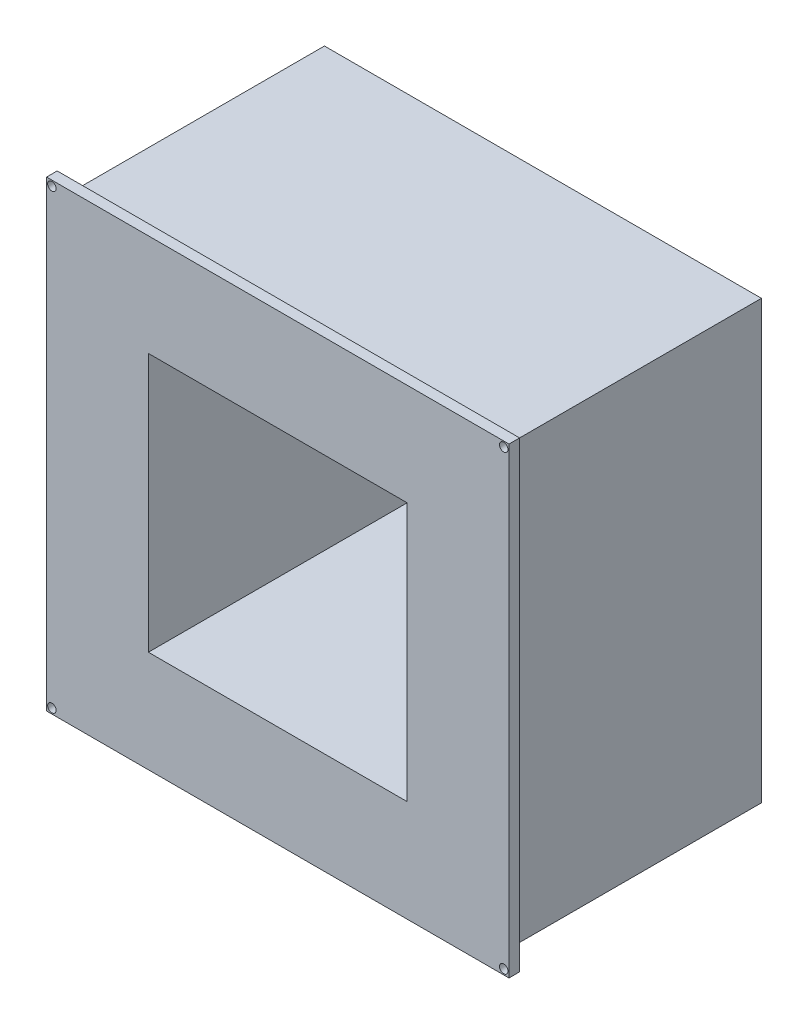
ISO-10303-21;
HEADER;
FILE_DESCRIPTION(('STEP AP214'),'2;1');
FILE_NAME('part.step','',(''),(''),'','','');
FILE_SCHEMA(('AUTOMOTIVE_DESIGN { 1 0 10303 214 1 1 1 1 }'));
ENDSEC;
DATA;
#1=APPLICATION_CONTEXT('core data for automotive mechanical design processes');
#2=APPLICATION_PROTOCOL_DEFINITION('international standard','automotive_design',2000,#1);
#3=PRODUCT_CONTEXT('',#1,'mechanical');
#4=PRODUCT('Part','Part','',(#3));
#5=PRODUCT_RELATED_PRODUCT_CATEGORY('part','',(#4));
#6=PRODUCT_DEFINITION_FORMATION('','',#4);
#7=PRODUCT_DEFINITION_CONTEXT('part definition',#1,'design');
#8=PRODUCT_DEFINITION('design','',#6,#7);
#9=PRODUCT_DEFINITION_SHAPE('','',#8);
#10=(LENGTH_UNIT() NAMED_UNIT(*) SI_UNIT(.MILLI.,.METRE.));
#11=(NAMED_UNIT(*) PLANE_ANGLE_UNIT() SI_UNIT($,.RADIAN.));
#12=(NAMED_UNIT(*) SI_UNIT($,.STERADIAN.) SOLID_ANGLE_UNIT());
#13=UNCERTAINTY_MEASURE_WITH_UNIT(LENGTH_MEASURE(1.E-05),#10,'distance_accuracy_value','');
#14=(GEOMETRIC_REPRESENTATION_CONTEXT(3) GLOBAL_UNCERTAINTY_ASSIGNED_CONTEXT((#13)) GLOBAL_UNIT_ASSIGNED_CONTEXT((#10,
#11,#12)) REPRESENTATION_CONTEXT('',''));
#15=CARTESIAN_POINT('',(0.,0.,0.));
#16=DIRECTION('',(0.,0.,1.));
#17=DIRECTION('',(1.,0.,0.));
#18=AXIS2_PLACEMENT_3D('',#15,#16,#17);
#19=CARTESIAN_POINT('',(0.,0.,125.));
#20=DIRECTION('',(0.,0.,1.));
#21=DIRECTION('',(1.,0.,0.));
#22=AXIS2_PLACEMENT_3D('',#19,#20,#21);
#23=PLANE('',#22);
#24=CARTESIAN_POINT('',(-106.5,-106.5,125.));
#25=DIRECTION('',(0.,0.,1.));
#26=DIRECTION('',(-1.,0.,0.));
#27=AXIS2_PLACEMENT_3D('',#24,#25,#26);
#28=CIRCLE('',#27,2.);
#29=CARTESIAN_POINT('',(-108.5,-106.5,125.));
#30=VERTEX_POINT('',#29);
#31=EDGE_CURVE('E562',#30,#30,#28,.T.);
#32=ORIENTED_EDGE('',*,*,#31,.F.);
#33=EDGE_LOOP('',(#32));
#34=FACE_BOUND('',#33,.T.);
#35=CARTESIAN_POINT('',(106.5,-106.5,125.));
#36=DIRECTION('',(0.,0.,1.));
#37=DIRECTION('',(1.,0.,0.));
#38=AXIS2_PLACEMENT_3D('',#35,#36,#37);
#39=CIRCLE('',#38,2.);
#40=CARTESIAN_POINT('',(108.5,-106.5,125.));
#41=VERTEX_POINT('',#40);
#42=EDGE_CURVE('E566',#41,#41,#39,.T.);
#43=ORIENTED_EDGE('',*,*,#42,.F.);
#44=EDGE_LOOP('',(#43));
#45=FACE_BOUND('',#44,.T.);
#46=CARTESIAN_POINT('',(106.5,106.5,125.));
#47=DIRECTION('',(0.,0.,1.));
#48=DIRECTION('',(-1.,0.,0.));
#49=AXIS2_PLACEMENT_3D('',#46,#47,#48);
#50=CIRCLE('',#49,2.);
#51=CARTESIAN_POINT('',(104.5,106.5,125.));
#52=VERTEX_POINT('',#51);
#53=EDGE_CURVE('E387',#52,#52,#50,.T.);
#54=ORIENTED_EDGE('',*,*,#53,.F.);
#55=EDGE_LOOP('',(#54));
#56=FACE_BOUND('',#55,.T.);
#57=CARTESIAN_POINT('',(-106.5,106.5,125.));
#58=DIRECTION('',(0.,0.,1.));
#59=DIRECTION('',(1.,0.,0.));
#60=AXIS2_PLACEMENT_3D('',#57,#58,#59);
#61=CIRCLE('',#60,2.);
#62=CARTESIAN_POINT('',(-104.5,106.5,125.));
#63=VERTEX_POINT('',#62);
#64=EDGE_CURVE('E228',#63,#63,#61,.T.);
#65=ORIENTED_EDGE('',*,*,#64,.F.);
#66=EDGE_LOOP('',(#65));
#67=FACE_BOUND('',#66,.T.);
#68=DIRECTION('',(0.,1.,0.));
#69=VECTOR('',#68,1.);
#70=CARTESIAN_POINT('',(109.,109.,125.));
#71=LINE('',#70,#69);
#72=CARTESIAN_POINT('',(109.,-109.,125.));
#73=VERTEX_POINT('',#72);
#74=CARTESIAN_POINT('',(109.,109.,125.));
#75=VERTEX_POINT('',#74);
#76=EDGE_CURVE('E261',#73,#75,#71,.T.);
#77=ORIENTED_EDGE('',*,*,#76,.T.);
#78=DIRECTION('',(-1.,0.,0.));
#79=VECTOR('',#78,1.);
#80=CARTESIAN_POINT('',(-109.,109.,125.));
#81=LINE('',#80,#79);
#82=CARTESIAN_POINT('',(-109.,109.,125.));
#83=VERTEX_POINT('',#82);
#84=EDGE_CURVE('E397',#75,#83,#81,.T.);
#85=ORIENTED_EDGE('',*,*,#84,.T.);
#86=DIRECTION('',(0.,-1.,0.));
#87=VECTOR('',#86,1.);
#88=CARTESIAN_POINT('',(-109.,109.,125.));
#89=LINE('',#88,#87);
#90=CARTESIAN_POINT('',(-109.,-109.,125.));
#91=VERTEX_POINT('',#90);
#92=EDGE_CURVE('E405',#83,#91,#89,.T.);
#93=ORIENTED_EDGE('',*,*,#92,.T.);
#94=DIRECTION('',(1.,0.,0.));
#95=VECTOR('',#94,1.);
#96=CARTESIAN_POINT('',(-109.,-109.,125.));
#97=LINE('',#96,#95);
#98=EDGE_CURVE('E253',#91,#73,#97,.T.);
#99=ORIENTED_EDGE('',*,*,#98,.T.);
#100=EDGE_LOOP('',(#77,#85,#93,#99));
#101=FACE_BOUND('',#100,.T.);
#102=DIRECTION('',(1.,0.,0.));
#103=VECTOR('',#102,1.);
#104=CARTESIAN_POINT('',(0.,61.,125.));
#105=LINE('',#104,#103);
#106=CARTESIAN_POINT('',(-61.,61.,125.));
#107=VERTEX_POINT('',#106);
#108=CARTESIAN_POINT('',(61.,61.,125.));
#109=VERTEX_POINT('',#108);
#110=EDGE_CURVE('E103',#107,#109,#105,.T.);
#111=ORIENTED_EDGE('',*,*,#110,.T.);
#112=DIRECTION('',(0.,-1.,0.));
#113=VECTOR('',#112,1.);
#114=CARTESIAN_POINT('',(61.,0.,125.));
#115=LINE('',#114,#113);
#116=CARTESIAN_POINT('',(61.,-61.,125.));
#117=VERTEX_POINT('',#116);
#118=EDGE_CURVE('E12',#109,#117,#115,.T.);
#119=ORIENTED_EDGE('',*,*,#118,.T.);
#120=DIRECTION('',(-1.,0.,0.));
#121=VECTOR('',#120,1.);
#122=CARTESIAN_POINT('',(0.,-61.,125.));
#123=LINE('',#122,#121);
#124=CARTESIAN_POINT('',(-61.,-61.,125.));
#125=VERTEX_POINT('',#124);
#126=EDGE_CURVE('E208',#117,#125,#123,.T.);
#127=ORIENTED_EDGE('',*,*,#126,.T.);
#128=DIRECTION('',(0.,1.,0.));
#129=VECTOR('',#128,1.);
#130=CARTESIAN_POINT('',(-61.,0.,125.));
#131=LINE('',#130,#129);
#132=EDGE_CURVE('E213',#125,#107,#131,.T.);
#133=ORIENTED_EDGE('',*,*,#132,.T.);
#134=EDGE_LOOP('',(#111,#119,#127,#133));
#135=FACE_BOUND('',#134,.T.);
#136=ADVANCED_FACE('F93',(#34,#45,#56,#67,#101,#135),#23,.T.);
#137=CARTESIAN_POINT('',(0.,0.,0.));
#138=DIRECTION('',(0.,0.,1.));
#139=DIRECTION('',(1.,0.,0.));
#140=AXIS2_PLACEMENT_3D('',#137,#138,#139);
#141=PLANE('',#140);
#142=DIRECTION('',(0.,1.,0.));
#143=VECTOR('',#142,1.);
#144=CARTESIAN_POINT('',(103.,100.,0.));
#145=LINE('',#144,#143);
#146=CARTESIAN_POINT('',(103.,-103.,0.));
#147=VERTEX_POINT('',#146);
#148=CARTESIAN_POINT('',(103.,103.,0.));
#149=VERTEX_POINT('',#148);
#150=EDGE_CURVE('E297',#147,#149,#145,.T.);
#151=ORIENTED_EDGE('',*,*,#150,.F.);
#152=DIRECTION('',(1.,0.,0.));
#153=VECTOR('',#152,1.);
#154=CARTESIAN_POINT('',(-100.,-103.,0.));
#155=LINE('',#154,#153);
#156=CARTESIAN_POINT('',(-103.,-103.,0.));
#157=VERTEX_POINT('',#156);
#158=EDGE_CURVE('E140',#157,#147,#155,.T.);
#159=ORIENTED_EDGE('',*,*,#158,.F.);
#160=DIRECTION('',(0.,-1.,0.));
#161=VECTOR('',#160,1.);
#162=CARTESIAN_POINT('',(-103.,100.,0.));
#163=LINE('',#162,#161);
#164=CARTESIAN_POINT('',(-103.,103.,0.));
#165=VERTEX_POINT('',#164);
#166=EDGE_CURVE('E319',#165,#157,#163,.T.);
#167=ORIENTED_EDGE('',*,*,#166,.F.);
#168=DIRECTION('',(-1.,0.,0.));
#169=VECTOR('',#168,1.);
#170=CARTESIAN_POINT('',(-100.,103.,0.));
#171=LINE('',#170,#169);
#172=EDGE_CURVE('E316',#149,#165,#171,.T.);
#173=ORIENTED_EDGE('',*,*,#172,.F.);
#174=EDGE_LOOP('',(#151,#159,#167,#173));
#175=FACE_BOUND('',#174,.T.);
#176=DIRECTION('',(0.,1.,0.));
#177=VECTOR('',#176,1.);
#178=CARTESIAN_POINT('',(61.,61.,0.));
#179=LINE('',#178,#177);
#180=CARTESIAN_POINT('',(61.,-61.,0.));
#181=VERTEX_POINT('',#180);
#182=CARTESIAN_POINT('',(61.,61.,0.));
#183=VERTEX_POINT('',#182);
#184=EDGE_CURVE('E202',#181,#183,#179,.T.);
#185=ORIENTED_EDGE('',*,*,#184,.T.);
#186=DIRECTION('',(-1.,0.,0.));
#187=VECTOR('',#186,1.);
#188=CARTESIAN_POINT('',(-61.,61.,0.));
#189=LINE('',#188,#187);
#190=CARTESIAN_POINT('',(-61.,61.,0.));
#191=VERTEX_POINT('',#190);
#192=EDGE_CURVE('E279',#183,#191,#189,.T.);
#193=ORIENTED_EDGE('',*,*,#192,.T.);
#194=DIRECTION('',(0.,-1.,0.));
#195=VECTOR('',#194,1.);
#196=CARTESIAN_POINT('',(-61.,61.,0.));
#197=LINE('',#196,#195);
#198=CARTESIAN_POINT('',(-61.,-61.,0.));
#199=VERTEX_POINT('',#198);
#200=EDGE_CURVE('E283',#191,#199,#197,.T.);
#201=ORIENTED_EDGE('',*,*,#200,.T.);
#202=DIRECTION('',(1.,0.,0.));
#203=VECTOR('',#202,1.);
#204=CARTESIAN_POINT('',(-61.,-61.,0.));
#205=LINE('',#204,#203);
#206=EDGE_CURVE('E205',#199,#181,#205,.T.);
#207=ORIENTED_EDGE('',*,*,#206,.T.);
#208=EDGE_LOOP('',(#185,#193,#201,#207));
#209=FACE_BOUND('',#208,.T.);
#210=ADVANCED_FACE('F337',(#175,#209),#141,.F.);
#211=CARTESIAN_POINT('',(103.,100.,120.));
#212=DIRECTION('',(-1.,0.,0.));
#213=DIRECTION('',(0.,-1.,0.));
#214=AXIS2_PLACEMENT_3D('',#211,#212,#213);
#215=PLANE('',#214);
#216=ORIENTED_EDGE('',*,*,#150,.T.);
#217=DIRECTION('',(0.,0.,-1.));
#218=VECTOR('',#217,1.);
#219=CARTESIAN_POINT('',(103.,103.,120.));
#220=LINE('',#219,#218);
#221=CARTESIAN_POINT('',(103.,103.,120.));
#222=VERTEX_POINT('',#221);
#223=EDGE_CURVE('E214',#222,#149,#220,.T.);
#224=ORIENTED_EDGE('',*,*,#223,.F.);
#225=DIRECTION('',(0.,1.,0.));
#226=VECTOR('',#225,1.);
#227=CARTESIAN_POINT('',(103.,100.,120.));
#228=LINE('',#227,#226);
#229=CARTESIAN_POINT('',(103.,-103.,120.));
#230=VERTEX_POINT('',#229);
#231=EDGE_CURVE('E298',#230,#222,#228,.T.);
#232=ORIENTED_EDGE('',*,*,#231,.F.);
#233=DIRECTION('',(0.,0.,-1.));
#234=VECTOR('',#233,1.);
#235=CARTESIAN_POINT('',(103.,-103.,120.));
#236=LINE('',#235,#234);
#237=EDGE_CURVE('E312',#230,#147,#236,.T.);
#238=ORIENTED_EDGE('',*,*,#237,.T.);
#239=EDGE_LOOP('',(#216,#224,#232,#238));
#240=FACE_BOUND('',#239,.T.);
#241=ADVANCED_FACE('F95',(#240),#215,.F.);
#242=CARTESIAN_POINT('',(-100.,103.,120.));
#243=DIRECTION('',(0.,-1.,0.));
#244=DIRECTION('',(0.,0.,-1.));
#245=AXIS2_PLACEMENT_3D('',#242,#243,#244);
#246=PLANE('',#245);
#247=ORIENTED_EDGE('',*,*,#172,.T.);
#248=DIRECTION('',(0.,0.,-1.));
#249=VECTOR('',#248,1.);
#250=CARTESIAN_POINT('',(-103.,103.,120.));
#251=LINE('',#250,#249);
#252=CARTESIAN_POINT('',(-103.,103.,120.));
#253=VERTEX_POINT('',#252);
#254=EDGE_CURVE('E328',#253,#165,#251,.T.);
#255=ORIENTED_EDGE('',*,*,#254,.F.);
#256=DIRECTION('',(-1.,0.,0.));
#257=VECTOR('',#256,1.);
#258=CARTESIAN_POINT('',(-100.,103.,120.));
#259=LINE('',#258,#257);
#260=EDGE_CURVE('E146',#222,#253,#259,.T.);
#261=ORIENTED_EDGE('',*,*,#260,.F.);
#262=ORIENTED_EDGE('',*,*,#223,.T.);
#263=EDGE_LOOP('',(#247,#255,#261,#262));
#264=FACE_BOUND('',#263,.T.);
#265=ADVANCED_FACE('F333',(#264),#246,.F.);
#266=CARTESIAN_POINT('',(-103.,100.,120.));
#267=DIRECTION('',(1.,0.,0.));
#268=DIRECTION('',(0.,1.,0.));
#269=AXIS2_PLACEMENT_3D('',#266,#267,#268);
#270=PLANE('',#269);
#271=ORIENTED_EDGE('',*,*,#166,.T.);
#272=DIRECTION('',(0.,0.,-1.));
#273=VECTOR('',#272,1.);
#274=CARTESIAN_POINT('',(-103.,-103.,120.));
#275=LINE('',#274,#273);
#276=CARTESIAN_POINT('',(-103.,-103.,120.));
#277=VERTEX_POINT('',#276);
#278=EDGE_CURVE('E120',#277,#157,#275,.T.);
#279=ORIENTED_EDGE('',*,*,#278,.F.);
#280=DIRECTION('',(0.,-1.,0.));
#281=VECTOR('',#280,1.);
#282=CARTESIAN_POINT('',(-103.,100.,120.));
#283=LINE('',#282,#281);
#284=EDGE_CURVE('E304',#253,#277,#283,.T.);
#285=ORIENTED_EDGE('',*,*,#284,.F.);
#286=ORIENTED_EDGE('',*,*,#254,.T.);
#287=EDGE_LOOP('',(#271,#279,#285,#286));
#288=FACE_BOUND('',#287,.T.);
#289=ADVANCED_FACE('F340',(#288),#270,.F.);
#290=CARTESIAN_POINT('',(-100.,-103.,120.));
#291=DIRECTION('',(0.,1.,0.));
#292=DIRECTION('',(0.,0.,1.));
#293=AXIS2_PLACEMENT_3D('',#290,#291,#292);
#294=PLANE('',#293);
#295=ORIENTED_EDGE('',*,*,#158,.T.);
#296=ORIENTED_EDGE('',*,*,#237,.F.);
#297=DIRECTION('',(1.,0.,0.));
#298=VECTOR('',#297,1.);
#299=CARTESIAN_POINT('',(-100.,-103.,120.));
#300=LINE('',#299,#298);
#301=EDGE_CURVE('E308',#277,#230,#300,.T.);
#302=ORIENTED_EDGE('',*,*,#301,.F.);
#303=ORIENTED_EDGE('',*,*,#278,.T.);
#304=EDGE_LOOP('',(#295,#296,#302,#303));
#305=FACE_BOUND('',#304,.T.);
#306=ADVANCED_FACE('F341',(#305),#294,.F.);
#307=CARTESIAN_POINT('',(61.,61.,120.));
#308=DIRECTION('',(-1.,0.,0.));
#309=DIRECTION('',(0.,-1.,0.));
#310=AXIS2_PLACEMENT_3D('',#307,#308,#309);
#311=PLANE('',#310);
#312=ORIENTED_EDGE('',*,*,#184,.F.);
#313=DIRECTION('',(0.,0.,-1.));
#314=VECTOR('',#313,1.);
#315=CARTESIAN_POINT('',(61.,-61.,120.));
#316=LINE('',#315,#314);
#317=EDGE_CURVE('E197',#117,#181,#316,.T.);
#318=ORIENTED_EDGE('',*,*,#317,.F.);
#319=ORIENTED_EDGE('',*,*,#118,.F.);
#320=DIRECTION('',(0.,0.,-1.));
#321=VECTOR('',#320,1.);
#322=CARTESIAN_POINT('',(61.,61.,120.));
#323=LINE('',#322,#321);
#324=EDGE_CURVE('E294',#109,#183,#323,.T.);
#325=ORIENTED_EDGE('',*,*,#324,.T.);
#326=EDGE_LOOP('',(#312,#318,#319,#325));
#327=FACE_BOUND('',#326,.T.);
#328=ADVANCED_FACE('F198',(#327),#311,.T.);
#329=CARTESIAN_POINT('',(-61.,61.,120.));
#330=DIRECTION('',(0.,-1.,0.));
#331=DIRECTION('',(0.,0.,-1.));
#332=AXIS2_PLACEMENT_3D('',#329,#330,#331);
#333=PLANE('',#332);
#334=ORIENTED_EDGE('',*,*,#192,.F.);
#335=ORIENTED_EDGE('',*,*,#324,.F.);
#336=ORIENTED_EDGE('',*,*,#110,.F.);
#337=DIRECTION('',(0.,0.,-1.));
#338=VECTOR('',#337,1.);
#339=CARTESIAN_POINT('',(-61.,61.,120.));
#340=LINE('',#339,#338);
#341=EDGE_CURVE('E291',#107,#191,#340,.T.);
#342=ORIENTED_EDGE('',*,*,#341,.T.);
#343=EDGE_LOOP('',(#334,#335,#336,#342));
#344=FACE_BOUND('',#343,.T.);
#345=ADVANCED_FACE('F427',(#344),#333,.T.);
#346=CARTESIAN_POINT('',(-61.,61.,120.));
#347=DIRECTION('',(1.,0.,0.));
#348=DIRECTION('',(0.,1.,0.));
#349=AXIS2_PLACEMENT_3D('',#346,#347,#348);
#350=PLANE('',#349);
#351=ORIENTED_EDGE('',*,*,#200,.F.);
#352=ORIENTED_EDGE('',*,*,#341,.F.);
#353=ORIENTED_EDGE('',*,*,#132,.F.);
#354=DIRECTION('',(0.,0.,-1.));
#355=VECTOR('',#354,1.);
#356=CARTESIAN_POINT('',(-61.,-61.,120.));
#357=LINE('',#356,#355);
#358=EDGE_CURVE('E111',#125,#199,#357,.T.);
#359=ORIENTED_EDGE('',*,*,#358,.T.);
#360=EDGE_LOOP('',(#351,#352,#353,#359));
#361=FACE_BOUND('',#360,.T.);
#362=ADVANCED_FACE('F355',(#361),#350,.T.);
#363=CARTESIAN_POINT('',(-61.,-61.,120.));
#364=DIRECTION('',(0.,1.,0.));
#365=DIRECTION('',(0.,0.,1.));
#366=AXIS2_PLACEMENT_3D('',#363,#364,#365);
#367=PLANE('',#366);
#368=ORIENTED_EDGE('',*,*,#206,.F.);
#369=ORIENTED_EDGE('',*,*,#358,.F.);
#370=ORIENTED_EDGE('',*,*,#126,.F.);
#371=ORIENTED_EDGE('',*,*,#317,.T.);
#372=EDGE_LOOP('',(#368,#369,#370,#371));
#373=FACE_BOUND('',#372,.T.);
#374=ADVANCED_FACE('F209',(#373),#367,.T.);
#375=CARTESIAN_POINT('',(0.,0.,120.));
#376=DIRECTION('',(0.,0.,1.));
#377=DIRECTION('',(1.,0.,0.));
#378=AXIS2_PLACEMENT_3D('',#375,#376,#377);
#379=PLANE('',#378);
#380=CARTESIAN_POINT('',(-106.5,-106.5,120.));
#381=DIRECTION('',(0.,0.,1.));
#382=DIRECTION('',(1.,0.,0.));
#383=AXIS2_PLACEMENT_3D('',#380,#381,#382);
#384=CIRCLE('',#383,2.);
#385=CARTESIAN_POINT('',(-104.5,-106.5,120.));
#386=VERTEX_POINT('',#385);
#387=EDGE_CURVE('E97',#386,#386,#384,.T.);
#388=ORIENTED_EDGE('',*,*,#387,.T.);
#389=EDGE_LOOP('',(#388));
#390=FACE_BOUND('',#389,.T.);
#391=CARTESIAN_POINT('',(106.5,-106.5,120.));
#392=DIRECTION('',(0.,0.,1.));
#393=DIRECTION('',(1.,0.,0.));
#394=AXIS2_PLACEMENT_3D('',#391,#392,#393);
#395=CIRCLE('',#394,2.);
#396=CARTESIAN_POINT('',(108.5,-106.5,120.));
#397=VERTEX_POINT('',#396);
#398=EDGE_CURVE('E231',#397,#397,#395,.T.);
#399=ORIENTED_EDGE('',*,*,#398,.T.);
#400=EDGE_LOOP('',(#399));
#401=FACE_BOUND('',#400,.T.);
#402=CARTESIAN_POINT('',(106.5,106.5,120.));
#403=DIRECTION('',(0.,0.,1.));
#404=DIRECTION('',(1.,0.,0.));
#405=AXIS2_PLACEMENT_3D('',#402,#403,#404);
#406=CIRCLE('',#405,2.);
#407=CARTESIAN_POINT('',(108.5,106.5,120.));
#408=VERTEX_POINT('',#407);
#409=EDGE_CURVE('E227',#408,#408,#406,.T.);
#410=ORIENTED_EDGE('',*,*,#409,.T.);
#411=EDGE_LOOP('',(#410));
#412=FACE_BOUND('',#411,.T.);
#413=CARTESIAN_POINT('',(-106.5,106.5,120.));
#414=DIRECTION('',(0.,0.,1.));
#415=DIRECTION('',(1.,0.,0.));
#416=AXIS2_PLACEMENT_3D('',#413,#414,#415);
#417=CIRCLE('',#416,2.);
#418=CARTESIAN_POINT('',(-104.5,106.5,120.));
#419=VERTEX_POINT('',#418);
#420=EDGE_CURVE('E223',#419,#419,#417,.T.);
#421=ORIENTED_EDGE('',*,*,#420,.T.);
#422=EDGE_LOOP('',(#421));
#423=FACE_BOUND('',#422,.T.);
#424=DIRECTION('',(0.,1.,0.));
#425=VECTOR('',#424,1.);
#426=CARTESIAN_POINT('',(109.,109.,120.));
#427=LINE('',#426,#425);
#428=CARTESIAN_POINT('',(109.,-109.,120.));
#429=VERTEX_POINT('',#428);
#430=CARTESIAN_POINT('',(109.,109.,120.));
#431=VERTEX_POINT('',#430);
#432=EDGE_CURVE('E238',#429,#431,#427,.T.);
#433=ORIENTED_EDGE('',*,*,#432,.F.);
#434=DIRECTION('',(1.,0.,0.));
#435=VECTOR('',#434,1.);
#436=CARTESIAN_POINT('',(-109.,-109.,120.));
#437=LINE('',#436,#435);
#438=CARTESIAN_POINT('',(-109.,-109.,120.));
#439=VERTEX_POINT('',#438);
#440=EDGE_CURVE('E258',#439,#429,#437,.T.);
#441=ORIENTED_EDGE('',*,*,#440,.F.);
#442=DIRECTION('',(0.,-1.,0.));
#443=VECTOR('',#442,1.);
#444=CARTESIAN_POINT('',(-109.,109.,120.));
#445=LINE('',#444,#443);
#446=CARTESIAN_POINT('',(-109.,109.,120.));
#447=VERTEX_POINT('',#446);
#448=EDGE_CURVE('E250',#447,#439,#445,.T.);
#449=ORIENTED_EDGE('',*,*,#448,.F.);
#450=DIRECTION('',(-1.,0.,0.));
#451=VECTOR('',#450,1.);
#452=CARTESIAN_POINT('',(-109.,109.,120.));
#453=LINE('',#452,#451);
#454=EDGE_CURVE('E243',#431,#447,#453,.T.);
#455=ORIENTED_EDGE('',*,*,#454,.F.);
#456=EDGE_LOOP('',(#433,#441,#449,#455));
#457=FACE_BOUND('',#456,.T.);
#458=ORIENTED_EDGE('',*,*,#301,.T.);
#459=ORIENTED_EDGE('',*,*,#231,.T.);
#460=ORIENTED_EDGE('',*,*,#260,.T.);
#461=ORIENTED_EDGE('',*,*,#284,.T.);
#462=EDGE_LOOP('',(#458,#459,#460,#461));
#463=FACE_BOUND('',#462,.T.);
#464=ADVANCED_FACE('F343',(#390,#401,#412,#423,#457,#463),#379,.F.);
#465=CARTESIAN_POINT('',(109.,109.,125.));
#466=DIRECTION('',(-1.,0.,0.));
#467=DIRECTION('',(0.,-1.,0.));
#468=AXIS2_PLACEMENT_3D('',#465,#466,#467);
#469=PLANE('',#468);
#470=ORIENTED_EDGE('',*,*,#432,.T.);
#471=DIRECTION('',(0.,0.,-1.));
#472=VECTOR('',#471,1.);
#473=CARTESIAN_POINT('',(109.,109.,125.));
#474=LINE('',#473,#472);
#475=EDGE_CURVE('E273',#75,#431,#474,.T.);
#476=ORIENTED_EDGE('',*,*,#475,.F.);
#477=ORIENTED_EDGE('',*,*,#76,.F.);
#478=DIRECTION('',(0.,0.,-1.));
#479=VECTOR('',#478,1.);
#480=CARTESIAN_POINT('',(109.,-109.,125.));
#481=LINE('',#480,#479);
#482=EDGE_CURVE('E262',#73,#429,#481,.T.);
#483=ORIENTED_EDGE('',*,*,#482,.T.);
#484=EDGE_LOOP('',(#470,#476,#477,#483));
#485=FACE_BOUND('',#484,.T.);
#486=ADVANCED_FACE('F345',(#485),#469,.F.);
#487=CARTESIAN_POINT('',(-109.,109.,125.));
#488=DIRECTION('',(0.,-1.,0.));
#489=DIRECTION('',(0.,0.,-1.));
#490=AXIS2_PLACEMENT_3D('',#487,#488,#489);
#491=PLANE('',#490);
#492=ORIENTED_EDGE('',*,*,#454,.T.);
#493=DIRECTION('',(0.,0.,-1.));
#494=VECTOR('',#493,1.);
#495=CARTESIAN_POINT('',(-109.,109.,125.));
#496=LINE('',#495,#494);
#497=EDGE_CURVE('E269',#83,#447,#496,.T.);
#498=ORIENTED_EDGE('',*,*,#497,.F.);
#499=ORIENTED_EDGE('',*,*,#84,.F.);
#500=ORIENTED_EDGE('',*,*,#475,.T.);
#501=EDGE_LOOP('',(#492,#498,#499,#500));
#502=FACE_BOUND('',#501,.T.);
#503=ADVANCED_FACE('F352',(#502),#491,.F.);
#504=CARTESIAN_POINT('',(-109.,109.,125.));
#505=DIRECTION('',(1.,0.,0.));
#506=DIRECTION('',(0.,1.,0.));
#507=AXIS2_PLACEMENT_3D('',#504,#505,#506);
#508=PLANE('',#507);
#509=ORIENTED_EDGE('',*,*,#448,.T.);
#510=DIRECTION('',(0.,0.,-1.));
#511=VECTOR('',#510,1.);
#512=CARTESIAN_POINT('',(-109.,-109.,125.));
#513=LINE('',#512,#511);
#514=EDGE_CURVE('E265',#91,#439,#513,.T.);
#515=ORIENTED_EDGE('',*,*,#514,.F.);
#516=ORIENTED_EDGE('',*,*,#92,.F.);
#517=ORIENTED_EDGE('',*,*,#497,.T.);
#518=EDGE_LOOP('',(#509,#515,#516,#517));
#519=FACE_BOUND('',#518,.T.);
#520=ADVANCED_FACE('F416',(#519),#508,.F.);
#521=CARTESIAN_POINT('',(-109.,-109.,125.));
#522=DIRECTION('',(0.,1.,0.));
#523=DIRECTION('',(0.,0.,1.));
#524=AXIS2_PLACEMENT_3D('',#521,#522,#523);
#525=PLANE('',#524);
#526=ORIENTED_EDGE('',*,*,#440,.T.);
#527=ORIENTED_EDGE('',*,*,#482,.F.);
#528=ORIENTED_EDGE('',*,*,#98,.F.);
#529=ORIENTED_EDGE('',*,*,#514,.T.);
#530=EDGE_LOOP('',(#526,#527,#528,#529));
#531=FACE_BOUND('',#530,.T.);
#532=ADVANCED_FACE('F370',(#531),#525,.F.);
#533=CARTESIAN_POINT('',(-106.5,106.5,115.));
#534=DIRECTION('',(0.,0.,1.));
#535=DIRECTION('',(1.,0.,0.));
#536=AXIS2_PLACEMENT_3D('',#533,#534,#535);
#537=CYLINDRICAL_SURFACE('',#536,2.);
#538=ORIENTED_EDGE('',*,*,#64,.T.);
#539=EDGE_LOOP('',(#538));
#540=FACE_BOUND('',#539,.T.);
#541=ORIENTED_EDGE('',*,*,#420,.F.);
#542=EDGE_LOOP('',(#541));
#543=FACE_BOUND('',#542,.T.);
#544=ADVANCED_FACE('F367',(#540,#543),#537,.F.);
#545=CARTESIAN_POINT('',(106.5,106.5,115.));
#546=DIRECTION('',(0.,0.,1.));
#547=DIRECTION('',(1.,0.,0.));
#548=AXIS2_PLACEMENT_3D('',#545,#546,#547);
#549=CYLINDRICAL_SURFACE('',#548,2.);
#550=ORIENTED_EDGE('',*,*,#53,.T.);
#551=EDGE_LOOP('',(#550));
#552=FACE_BOUND('',#551,.T.);
#553=ORIENTED_EDGE('',*,*,#409,.F.);
#554=EDGE_LOOP('',(#553));
#555=FACE_BOUND('',#554,.T.);
#556=ADVANCED_FACE('F369',(#552,#555),#549,.F.);
#557=CARTESIAN_POINT('',(106.5,-106.5,115.));
#558=DIRECTION('',(0.,0.,1.));
#559=DIRECTION('',(1.,0.,0.));
#560=AXIS2_PLACEMENT_3D('',#557,#558,#559);
#561=CYLINDRICAL_SURFACE('',#560,2.);
#562=ORIENTED_EDGE('',*,*,#42,.T.);
#563=EDGE_LOOP('',(#562));
#564=FACE_BOUND('',#563,.T.);
#565=ORIENTED_EDGE('',*,*,#398,.F.);
#566=EDGE_LOOP('',(#565));
#567=FACE_BOUND('',#566,.T.);
#568=ADVANCED_FACE('F375',(#564,#567),#561,.F.);
#569=CARTESIAN_POINT('',(-106.5,-106.5,115.));
#570=DIRECTION('',(0.,0.,1.));
#571=DIRECTION('',(1.,0.,0.));
#572=AXIS2_PLACEMENT_3D('',#569,#570,#571);
#573=CYLINDRICAL_SURFACE('',#572,2.);
#574=ORIENTED_EDGE('',*,*,#31,.T.);
#575=EDGE_LOOP('',(#574));
#576=FACE_BOUND('',#575,.T.);
#577=ORIENTED_EDGE('',*,*,#387,.F.);
#578=EDGE_LOOP('',(#577));
#579=FACE_BOUND('',#578,.T.);
#580=ADVANCED_FACE('F372',(#576,#579),#573,.F.);
#581=CLOSED_SHELL('',(#136,#210,#241,#265,#289,#306,#328,#345,#362,#374,#464,#486,#503,#520,
#532,#544,#556,#568,#580));
#582=MANIFOLD_SOLID_BREP('B2',#581);
#583=ADVANCED_BREP_SHAPE_REPRESENTATION('',(#18,#582),#14);
#584=SHAPE_DEFINITION_REPRESENTATION(#9,#583);
ENDSEC;
END-ISO-10303-21;
